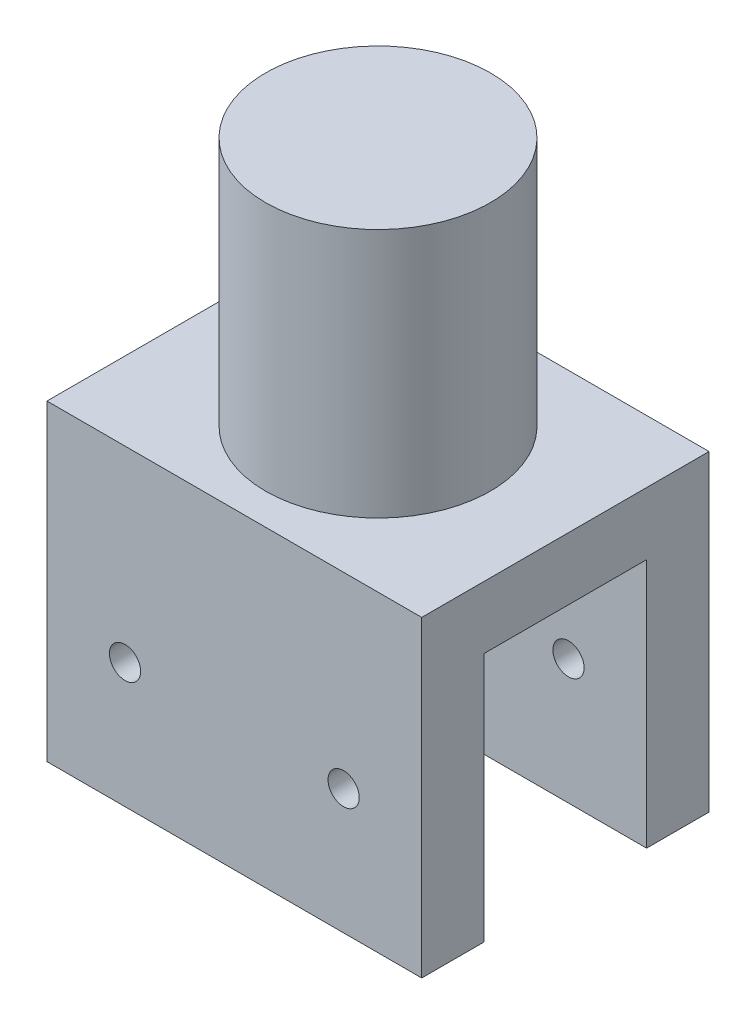
ISO-10303-21;
HEADER;
FILE_DESCRIPTION(('STEP AP214'),'2;1');
FILE_NAME('part.step','',(''),(''),'','','');
FILE_SCHEMA(('AUTOMOTIVE_DESIGN { 1 0 10303 214 1 1 1 1 }'));
ENDSEC;
DATA;
#1=APPLICATION_CONTEXT('core data for automotive mechanical design processes');
#2=APPLICATION_PROTOCOL_DEFINITION('international standard','automotive_design',2000,#1);
#3=PRODUCT_CONTEXT('',#1,'mechanical');
#4=PRODUCT('Part','Part','',(#3));
#5=PRODUCT_RELATED_PRODUCT_CATEGORY('part','',(#4));
#6=PRODUCT_DEFINITION_FORMATION('','',#4);
#7=PRODUCT_DEFINITION_CONTEXT('part definition',#1,'design');
#8=PRODUCT_DEFINITION('design','',#6,#7);
#9=PRODUCT_DEFINITION_SHAPE('','',#8);
#10=(LENGTH_UNIT() NAMED_UNIT(*) SI_UNIT(.MILLI.,.METRE.));
#11=(NAMED_UNIT(*) PLANE_ANGLE_UNIT() SI_UNIT($,.RADIAN.));
#12=(NAMED_UNIT(*) SI_UNIT($,.STERADIAN.) SOLID_ANGLE_UNIT());
#13=UNCERTAINTY_MEASURE_WITH_UNIT(LENGTH_MEASURE(1.E-05),#10,'distance_accuracy_value','');
#14=(GEOMETRIC_REPRESENTATION_CONTEXT(3) GLOBAL_UNCERTAINTY_ASSIGNED_CONTEXT((#13)) GLOBAL_UNIT_ASSIGNED_CONTEXT((#10,
#11,#12)) REPRESENTATION_CONTEXT('',''));
#15=CARTESIAN_POINT('',(0.,0.,0.));
#16=DIRECTION('',(0.,0.,1.));
#17=DIRECTION('',(1.,0.,0.));
#18=AXIS2_PLACEMENT_3D('',#15,#16,#17);
#19=CARTESIAN_POINT('',(0.,0.,0.));
#20=DIRECTION('',(0.,1.,0.));
#21=DIRECTION('',(0.,0.,1.));
#22=AXIS2_PLACEMENT_3D('',#19,#20,#21);
#23=PLANE('',#22);
#24=DIRECTION('',(-1.,0.,0.));
#25=VECTOR('',#24,1.);
#26=CARTESIAN_POINT('',(-30.,0.,-13.));
#27=LINE('',#26,#25);
#28=CARTESIAN_POINT('',(30.,0.,-13.));
#29=VERTEX_POINT('',#28);
#30=CARTESIAN_POINT('',(-30.,0.,-13.));
#31=VERTEX_POINT('',#30);
#32=EDGE_CURVE('E125',#29,#31,#27,.T.);
#33=ORIENTED_EDGE('',*,*,#32,.F.);
#34=DIRECTION('',(0.,0.,-1.));
#35=VECTOR('',#34,1.);
#36=CARTESIAN_POINT('',(30.,0.,-23.));
#37=LINE('',#36,#35);
#38=CARTESIAN_POINT('',(30.,0.,13.));
#39=VERTEX_POINT('',#38);
#40=EDGE_CURVE('E156',#39,#29,#37,.T.);
#41=ORIENTED_EDGE('',*,*,#40,.F.);
#42=DIRECTION('',(1.,0.,0.));
#43=VECTOR('',#42,1.);
#44=CARTESIAN_POINT('',(-30.,0.,13.));
#45=LINE('',#44,#43);
#46=CARTESIAN_POINT('',(-30.,0.,13.));
#47=VERTEX_POINT('',#46);
#48=EDGE_CURVE('E136',#47,#39,#45,.T.);
#49=ORIENTED_EDGE('',*,*,#48,.F.);
#50=DIRECTION('',(0.,0.,1.));
#51=VECTOR('',#50,1.);
#52=CARTESIAN_POINT('',(-30.,0.,-23.));
#53=LINE('',#52,#51);
#54=EDGE_CURVE('E59',#31,#47,#53,.T.);
#55=ORIENTED_EDGE('',*,*,#54,.F.);
#56=EDGE_LOOP('',(#33,#41,#49,#55));
#57=FACE_BOUND('',#56,.T.);
#58=ADVANCED_FACE('F37',(#57),#23,.F.);
#59=CARTESIAN_POINT('',(30.,10.,-23.));
#60=DIRECTION('',(-1.,0.,0.));
#61=DIRECTION('',(0.,0.,1.));
#62=AXIS2_PLACEMENT_3D('',#59,#60,#61);
#63=PLANE('',#62);
#64=DIRECTION('',(0.,-1.,0.));
#65=VECTOR('',#64,1.);
#66=CARTESIAN_POINT('',(30.,10.,23.));
#67=LINE('',#66,#65);
#68=CARTESIAN_POINT('',(30.,10.,23.));
#69=VERTEX_POINT('',#68);
#70=CARTESIAN_POINT('',(30.,-40.,23.));
#71=VERTEX_POINT('',#70);
#72=EDGE_CURVE('E165',#69,#71,#67,.T.);
#73=ORIENTED_EDGE('',*,*,#72,.T.);
#74=DIRECTION('',(0.,0.,1.));
#75=VECTOR('',#74,1.);
#76=CARTESIAN_POINT('',(30.,-40.,23.));
#77=LINE('',#76,#75);
#78=CARTESIAN_POINT('',(30.,-40.,13.));
#79=VERTEX_POINT('',#78);
#80=EDGE_CURVE('E142',#79,#71,#77,.T.);
#81=ORIENTED_EDGE('',*,*,#80,.F.);
#82=DIRECTION('',(0.,1.,0.));
#83=VECTOR('',#82,1.);
#84=CARTESIAN_POINT('',(30.,-40.,13.));
#85=LINE('',#84,#83);
#86=EDGE_CURVE('E148',#79,#39,#85,.T.);
#87=ORIENTED_EDGE('',*,*,#86,.T.);
#88=ORIENTED_EDGE('',*,*,#40,.T.);
#89=DIRECTION('',(0.,1.,0.));
#90=VECTOR('',#89,1.);
#91=CARTESIAN_POINT('',(30.,-40.,-13.));
#92=LINE('',#91,#90);
#93=CARTESIAN_POINT('',(30.,-40.,-13.));
#94=VERTEX_POINT('',#93);
#95=EDGE_CURVE('E134',#94,#29,#92,.T.);
#96=ORIENTED_EDGE('',*,*,#95,.F.);
#97=DIRECTION('',(0.,0.,1.));
#98=VECTOR('',#97,1.);
#99=CARTESIAN_POINT('',(30.,-40.,-23.));
#100=LINE('',#99,#98);
#101=CARTESIAN_POINT('',(30.,-40.,-23.));
#102=VERTEX_POINT('',#101);
#103=EDGE_CURVE('E120',#102,#94,#100,.T.);
#104=ORIENTED_EDGE('',*,*,#103,.F.);
#105=DIRECTION('',(0.,-1.,0.));
#106=VECTOR('',#105,1.);
#107=CARTESIAN_POINT('',(30.,10.,-23.));
#108=LINE('',#107,#106);
#109=CARTESIAN_POINT('',(30.,10.,-23.));
#110=VERTEX_POINT('',#109);
#111=EDGE_CURVE('E46',#110,#102,#108,.T.);
#112=ORIENTED_EDGE('',*,*,#111,.F.);
#113=DIRECTION('',(0.,0.,-1.));
#114=VECTOR('',#113,1.);
#115=CARTESIAN_POINT('',(30.,10.,-23.));
#116=LINE('',#115,#114);
#117=EDGE_CURVE('E157',#69,#110,#116,.T.);
#118=ORIENTED_EDGE('',*,*,#117,.F.);
#119=EDGE_LOOP('',(#73,#81,#87,#88,#96,#104,#112,#118));
#120=FACE_BOUND('',#119,.T.);
#121=ADVANCED_FACE('F39',(#120),#63,.F.);
#122=CARTESIAN_POINT('',(-30.,10.,-23.));
#123=DIRECTION('',(0.,0.,1.));
#124=DIRECTION('',(1.,0.,0.));
#125=AXIS2_PLACEMENT_3D('',#122,#123,#124);
#126=PLANE('',#125);
#127=CARTESIAN_POINT('',(17.5,-20.,-23.));
#128=DIRECTION('',(0.,0.,-1.));
#129=DIRECTION('',(-1.,0.,0.));
#130=AXIS2_PLACEMENT_3D('',#127,#128,#129);
#131=CIRCLE('',#130,2.5);
#132=CARTESIAN_POINT('',(15.,-20.,-23.));
#133=VERTEX_POINT('',#132);
#134=EDGE_CURVE('E180',#133,#133,#131,.T.);
#135=ORIENTED_EDGE('',*,*,#134,.F.);
#136=EDGE_LOOP('',(#135));
#137=FACE_BOUND('',#136,.T.);
#138=CARTESIAN_POINT('',(-17.5,-20.,-23.));
#139=DIRECTION('',(0.,0.,-1.));
#140=DIRECTION('',(-1.,0.,0.));
#141=AXIS2_PLACEMENT_3D('',#138,#139,#140);
#142=CIRCLE('',#141,2.5);
#143=CARTESIAN_POINT('',(-20.,-20.,-23.));
#144=VERTEX_POINT('',#143);
#145=EDGE_CURVE('E190',#144,#144,#142,.T.);
#146=ORIENTED_EDGE('',*,*,#145,.F.);
#147=EDGE_LOOP('',(#146));
#148=FACE_BOUND('',#147,.T.);
#149=ORIENTED_EDGE('',*,*,#111,.T.);
#150=DIRECTION('',(1.,0.,0.));
#151=VECTOR('',#150,1.);
#152=CARTESIAN_POINT('',(-30.,-40.,-23.));
#153=LINE('',#152,#151);
#154=CARTESIAN_POINT('',(-30.,-40.,-23.));
#155=VERTEX_POINT('',#154);
#156=EDGE_CURVE('E115',#155,#102,#153,.T.);
#157=ORIENTED_EDGE('',*,*,#156,.F.);
#158=DIRECTION('',(0.,-1.,0.));
#159=VECTOR('',#158,1.);
#160=CARTESIAN_POINT('',(-30.,10.,-23.));
#161=LINE('',#160,#159);
#162=CARTESIAN_POINT('',(-30.,10.,-23.));
#163=VERTEX_POINT('',#162);
#164=EDGE_CURVE('E104',#163,#155,#161,.T.);
#165=ORIENTED_EDGE('',*,*,#164,.F.);
#166=DIRECTION('',(-1.,0.,0.));
#167=VECTOR('',#166,1.);
#168=CARTESIAN_POINT('',(-30.,10.,-23.));
#169=LINE('',#168,#167);
#170=EDGE_CURVE('E160',#110,#163,#169,.T.);
#171=ORIENTED_EDGE('',*,*,#170,.F.);
#172=EDGE_LOOP('',(#149,#157,#165,#171));
#173=FACE_BOUND('',#172,.T.);
#174=ADVANCED_FACE('F116',(#137,#148,#173),#126,.F.);
#175=CARTESIAN_POINT('',(-30.,10.,-23.));
#176=DIRECTION('',(1.,0.,0.));
#177=DIRECTION('',(0.,0.,-1.));
#178=AXIS2_PLACEMENT_3D('',#175,#176,#177);
#179=PLANE('',#178);
#180=ORIENTED_EDGE('',*,*,#164,.T.);
#181=DIRECTION('',(0.,0.,-1.));
#182=VECTOR('',#181,1.);
#183=CARTESIAN_POINT('',(-30.,-40.,-23.));
#184=LINE('',#183,#182);
#185=CARTESIAN_POINT('',(-30.,-40.,-13.));
#186=VERTEX_POINT('',#185);
#187=EDGE_CURVE('E108',#186,#155,#184,.T.);
#188=ORIENTED_EDGE('',*,*,#187,.F.);
#189=DIRECTION('',(0.,1.,0.));
#190=VECTOR('',#189,1.);
#191=CARTESIAN_POINT('',(-30.,-40.,-13.));
#192=LINE('',#191,#190);
#193=EDGE_CURVE('E54',#186,#31,#192,.T.);
#194=ORIENTED_EDGE('',*,*,#193,.T.);
#195=ORIENTED_EDGE('',*,*,#54,.T.);
#196=DIRECTION('',(0.,1.,0.));
#197=VECTOR('',#196,1.);
#198=CARTESIAN_POINT('',(-30.,-40.,13.));
#199=LINE('',#198,#197);
#200=CARTESIAN_POINT('',(-30.,-40.,13.));
#201=VERTEX_POINT('',#200);
#202=EDGE_CURVE('E153',#201,#47,#199,.T.);
#203=ORIENTED_EDGE('',*,*,#202,.F.);
#204=DIRECTION('',(0.,0.,-1.));
#205=VECTOR('',#204,1.);
#206=CARTESIAN_POINT('',(-30.,-40.,23.));
#207=LINE('',#206,#205);
#208=CARTESIAN_POINT('',(-30.,-40.,23.));
#209=VERTEX_POINT('',#208);
#210=EDGE_CURVE('E137',#209,#201,#207,.T.);
#211=ORIENTED_EDGE('',*,*,#210,.F.);
#212=DIRECTION('',(0.,-1.,0.));
#213=VECTOR('',#212,1.);
#214=CARTESIAN_POINT('',(-30.,10.,23.));
#215=LINE('',#214,#213);
#216=CARTESIAN_POINT('',(-30.,10.,23.));
#217=VERTEX_POINT('',#216);
#218=EDGE_CURVE('E112',#217,#209,#215,.T.);
#219=ORIENTED_EDGE('',*,*,#218,.F.);
#220=DIRECTION('',(0.,0.,1.));
#221=VECTOR('',#220,1.);
#222=CARTESIAN_POINT('',(-30.,10.,-23.));
#223=LINE('',#222,#221);
#224=EDGE_CURVE('E110',#163,#217,#223,.T.);
#225=ORIENTED_EDGE('',*,*,#224,.F.);
#226=EDGE_LOOP('',(#180,#188,#194,#195,#203,#211,#219,#225));
#227=FACE_BOUND('',#226,.T.);
#228=ADVANCED_FACE('F106',(#227),#179,.F.);
#229=CARTESIAN_POINT('',(-30.,10.,23.));
#230=DIRECTION('',(0.,0.,-1.));
#231=DIRECTION('',(-1.,0.,0.));
#232=AXIS2_PLACEMENT_3D('',#229,#230,#231);
#233=PLANE('',#232);
#234=CARTESIAN_POINT('',(17.5,-20.,23.));
#235=DIRECTION('',(0.,0.,-1.));
#236=DIRECTION('',(-1.,0.,0.));
#237=AXIS2_PLACEMENT_3D('',#234,#235,#236);
#238=CIRCLE('',#237,2.5);
#239=CARTESIAN_POINT('',(15.,-20.,23.));
#240=VERTEX_POINT('',#239);
#241=EDGE_CURVE('E174',#240,#240,#238,.T.);
#242=ORIENTED_EDGE('',*,*,#241,.T.);
#243=EDGE_LOOP('',(#242));
#244=FACE_BOUND('',#243,.T.);
#245=CARTESIAN_POINT('',(-17.5,-20.,23.));
#246=DIRECTION('',(0.,0.,-1.));
#247=DIRECTION('',(-1.,0.,0.));
#248=AXIS2_PLACEMENT_3D('',#245,#246,#247);
#249=CIRCLE('',#248,2.5);
#250=CARTESIAN_POINT('',(-20.,-20.,23.));
#251=VERTEX_POINT('',#250);
#252=EDGE_CURVE('E185',#251,#251,#249,.T.);
#253=ORIENTED_EDGE('',*,*,#252,.T.);
#254=EDGE_LOOP('',(#253));
#255=FACE_BOUND('',#254,.T.);
#256=ORIENTED_EDGE('',*,*,#218,.T.);
#257=DIRECTION('',(-1.,0.,0.));
#258=VECTOR('',#257,1.);
#259=CARTESIAN_POINT('',(-30.,-40.,23.));
#260=LINE('',#259,#258);
#261=EDGE_CURVE('E145',#71,#209,#260,.T.);
#262=ORIENTED_EDGE('',*,*,#261,.F.);
#263=ORIENTED_EDGE('',*,*,#72,.F.);
#264=DIRECTION('',(1.,0.,0.));
#265=VECTOR('',#264,1.);
#266=CARTESIAN_POINT('',(-30.,10.,23.));
#267=LINE('',#266,#265);
#268=EDGE_CURVE('E163',#217,#69,#267,.T.);
#269=ORIENTED_EDGE('',*,*,#268,.F.);
#270=EDGE_LOOP('',(#256,#262,#263,#269));
#271=FACE_BOUND('',#270,.T.);
#272=ADVANCED_FACE('F210',(#244,#255,#271),#233,.F.);
#273=CARTESIAN_POINT('',(0.,10.,0.));
#274=DIRECTION('',(0.,1.,0.));
#275=DIRECTION('',(0.,0.,1.));
#276=AXIS2_PLACEMENT_3D('',#273,#274,#275);
#277=PLANE('',#276);
#278=CARTESIAN_POINT('',(0.,10.,0.));
#279=DIRECTION('',(0.,1.,0.));
#280=DIRECTION('',(0.,0.,1.));
#281=AXIS2_PLACEMENT_3D('',#278,#279,#280);
#282=CIRCLE('',#281,18.);
#283=CARTESIAN_POINT('',(0.,10.,18.));
#284=VERTEX_POINT('',#283);
#285=EDGE_CURVE('E11',#284,#284,#282,.T.);
#286=ORIENTED_EDGE('',*,*,#285,.F.);
#287=EDGE_LOOP('',(#286));
#288=FACE_BOUND('',#287,.T.);
#289=ORIENTED_EDGE('',*,*,#117,.T.);
#290=ORIENTED_EDGE('',*,*,#170,.T.);
#291=ORIENTED_EDGE('',*,*,#224,.T.);
#292=ORIENTED_EDGE('',*,*,#268,.T.);
#293=EDGE_LOOP('',(#289,#290,#291,#292));
#294=FACE_BOUND('',#293,.T.);
#295=ADVANCED_FACE('F206',(#288,#294),#277,.T.);
#296=CARTESIAN_POINT('',(-30.,-40.,13.));
#297=DIRECTION('',(0.,0.,1.));
#298=DIRECTION('',(1.,0.,0.));
#299=AXIS2_PLACEMENT_3D('',#296,#297,#298);
#300=PLANE('',#299);
#301=CARTESIAN_POINT('',(17.5,-20.,13.));
#302=DIRECTION('',(0.,0.,1.));
#303=DIRECTION('',(1.,0.,0.));
#304=AXIS2_PLACEMENT_3D('',#301,#302,#303);
#305=CIRCLE('',#304,2.5);
#306=CARTESIAN_POINT('',(20.,-20.,13.));
#307=VERTEX_POINT('',#306);
#308=EDGE_CURVE('E193',#307,#307,#305,.T.);
#309=ORIENTED_EDGE('',*,*,#308,.T.);
#310=EDGE_LOOP('',(#309));
#311=FACE_BOUND('',#310,.T.);
#312=CARTESIAN_POINT('',(-17.5,-20.,13.));
#313=DIRECTION('',(0.,0.,1.));
#314=DIRECTION('',(1.,0.,0.));
#315=AXIS2_PLACEMENT_3D('',#312,#313,#314);
#316=CIRCLE('',#315,2.5);
#317=CARTESIAN_POINT('',(-15.,-20.,13.));
#318=VERTEX_POINT('',#317);
#319=EDGE_CURVE('E173',#318,#318,#316,.T.);
#320=ORIENTED_EDGE('',*,*,#319,.T.);
#321=EDGE_LOOP('',(#320));
#322=FACE_BOUND('',#321,.T.);
#323=ORIENTED_EDGE('',*,*,#48,.T.);
#324=ORIENTED_EDGE('',*,*,#86,.F.);
#325=DIRECTION('',(1.,0.,0.));
#326=VECTOR('',#325,1.);
#327=CARTESIAN_POINT('',(-30.,-40.,13.));
#328=LINE('',#327,#326);
#329=EDGE_CURVE('E140',#201,#79,#328,.T.);
#330=ORIENTED_EDGE('',*,*,#329,.F.);
#331=ORIENTED_EDGE('',*,*,#202,.T.);
#332=EDGE_LOOP('',(#323,#324,#330,#331));
#333=FACE_BOUND('',#332,.T.);
#334=ADVANCED_FACE('F209',(#311,#322,#333),#300,.F.);
#335=CARTESIAN_POINT('',(0.,-40.,0.));
#336=DIRECTION('',(0.,-1.,0.));
#337=DIRECTION('',(0.,0.,-1.));
#338=AXIS2_PLACEMENT_3D('',#335,#336,#337);
#339=PLANE('',#338);
#340=ORIENTED_EDGE('',*,*,#210,.T.);
#341=ORIENTED_EDGE('',*,*,#329,.T.);
#342=ORIENTED_EDGE('',*,*,#80,.T.);
#343=ORIENTED_EDGE('',*,*,#261,.T.);
#344=EDGE_LOOP('',(#340,#341,#342,#343));
#345=FACE_BOUND('',#344,.T.);
#346=ADVANCED_FACE('F225',(#345),#339,.T.);
#347=CARTESIAN_POINT('',(-30.,-40.,-13.));
#348=DIRECTION('',(0.,0.,-1.));
#349=DIRECTION('',(-1.,0.,0.));
#350=AXIS2_PLACEMENT_3D('',#347,#348,#349);
#351=PLANE('',#350);
#352=CARTESIAN_POINT('',(17.5,-20.,-13.));
#353=DIRECTION('',(0.,0.,-1.));
#354=DIRECTION('',(-1.,0.,0.));
#355=AXIS2_PLACEMENT_3D('',#352,#353,#354);
#356=CIRCLE('',#355,2.5);
#357=CARTESIAN_POINT('',(15.,-20.,-13.));
#358=VERTEX_POINT('',#357);
#359=EDGE_CURVE('E41',#358,#358,#356,.T.);
#360=ORIENTED_EDGE('',*,*,#359,.T.);
#361=EDGE_LOOP('',(#360));
#362=FACE_BOUND('',#361,.T.);
#363=CARTESIAN_POINT('',(-17.5,-20.,-13.));
#364=DIRECTION('',(0.,0.,-1.));
#365=DIRECTION('',(-1.,0.,0.));
#366=AXIS2_PLACEMENT_3D('',#363,#364,#365);
#367=CIRCLE('',#366,2.5);
#368=CARTESIAN_POINT('',(-20.,-20.,-13.));
#369=VERTEX_POINT('',#368);
#370=EDGE_CURVE('E171',#369,#369,#367,.T.);
#371=ORIENTED_EDGE('',*,*,#370,.T.);
#372=EDGE_LOOP('',(#371));
#373=FACE_BOUND('',#372,.T.);
#374=ORIENTED_EDGE('',*,*,#32,.T.);
#375=ORIENTED_EDGE('',*,*,#193,.F.);
#376=DIRECTION('',(-1.,0.,0.));
#377=VECTOR('',#376,1.);
#378=CARTESIAN_POINT('',(-30.,-40.,-13.));
#379=LINE('',#378,#377);
#380=EDGE_CURVE('E124',#94,#186,#379,.T.);
#381=ORIENTED_EDGE('',*,*,#380,.F.);
#382=ORIENTED_EDGE('',*,*,#95,.T.);
#383=EDGE_LOOP('',(#374,#375,#381,#382));
#384=FACE_BOUND('',#383,.T.);
#385=ADVANCED_FACE('F219',(#362,#373,#384),#351,.F.);
#386=CARTESIAN_POINT('',(0.,-40.,0.));
#387=DIRECTION('',(0.,1.,0.));
#388=DIRECTION('',(0.,0.,1.));
#389=AXIS2_PLACEMENT_3D('',#386,#387,#388);
#390=PLANE('',#389);
#391=ORIENTED_EDGE('',*,*,#187,.T.);
#392=ORIENTED_EDGE('',*,*,#156,.T.);
#393=ORIENTED_EDGE('',*,*,#103,.T.);
#394=ORIENTED_EDGE('',*,*,#380,.T.);
#395=EDGE_LOOP('',(#391,#392,#393,#394));
#396=FACE_BOUND('',#395,.T.);
#397=ADVANCED_FACE('F122',(#396),#390,.F.);
#398=CARTESIAN_POINT('',(0.,50.,0.));
#399=DIRECTION('',(0.,-1.,0.));
#400=DIRECTION('',(0.,0.,-1.));
#401=AXIS2_PLACEMENT_3D('',#398,#399,#400);
#402=CYLINDRICAL_SURFACE('',#401,18.);
#403=CARTESIAN_POINT('',(0.,50.,0.));
#404=DIRECTION('',(0.,1.,0.));
#405=DIRECTION('',(0.,0.,1.));
#406=AXIS2_PLACEMENT_3D('',#403,#404,#405);
#407=CIRCLE('',#406,18.);
#408=CARTESIAN_POINT('',(0.,50.,18.));
#409=VERTEX_POINT('',#408);
#410=EDGE_CURVE('E127',#409,#409,#407,.T.);
#411=ORIENTED_EDGE('',*,*,#410,.F.);
#412=EDGE_LOOP('',(#411));
#413=FACE_BOUND('',#412,.T.);
#414=ORIENTED_EDGE('',*,*,#285,.T.);
#415=EDGE_LOOP('',(#414));
#416=FACE_BOUND('',#415,.T.);
#417=ADVANCED_FACE('F200',(#413,#416),#402,.T.);
#418=CARTESIAN_POINT('',(0.,50.,0.));
#419=DIRECTION('',(0.,1.,0.));
#420=DIRECTION('',(0.,0.,1.));
#421=AXIS2_PLACEMENT_3D('',#418,#419,#420);
#422=PLANE('',#421);
#423=ORIENTED_EDGE('',*,*,#410,.T.);
#424=EDGE_LOOP('',(#423));
#425=FACE_BOUND('',#424,.T.);
#426=ADVANCED_FACE('F198',(#425),#422,.T.);
#427=CARTESIAN_POINT('',(-17.5,-20.,23.));
#428=DIRECTION('',(0.,0.,-1.));
#429=DIRECTION('',(-1.,0.,0.));
#430=AXIS2_PLACEMENT_3D('',#427,#428,#429);
#431=CYLINDRICAL_SURFACE('',#430,2.5);
#432=ORIENTED_EDGE('',*,*,#145,.T.);
#433=EDGE_LOOP('',(#432));
#434=FACE_BOUND('',#433,.T.);
#435=ORIENTED_EDGE('',*,*,#370,.F.);
#436=EDGE_LOOP('',(#435));
#437=FACE_BOUND('',#436,.T.);
#438=ADVANCED_FACE('F254',(#434,#437),#431,.F.);
#439=CARTESIAN_POINT('',(17.5,-20.,23.));
#440=DIRECTION('',(0.,0.,-1.));
#441=DIRECTION('',(-1.,0.,0.));
#442=AXIS2_PLACEMENT_3D('',#439,#440,#441);
#443=CYLINDRICAL_SURFACE('',#442,2.5);
#444=ORIENTED_EDGE('',*,*,#134,.T.);
#445=EDGE_LOOP('',(#444));
#446=FACE_BOUND('',#445,.T.);
#447=ORIENTED_EDGE('',*,*,#359,.F.);
#448=EDGE_LOOP('',(#447));
#449=FACE_BOUND('',#448,.T.);
#450=ADVANCED_FACE('F259',(#446,#449),#443,.F.);
#451=ORIENTED_EDGE('',*,*,#252,.F.);
#452=EDGE_LOOP('',(#451));
#453=FACE_BOUND('',#452,.T.);
#454=ORIENTED_EDGE('',*,*,#319,.F.);
#455=EDGE_LOOP('',(#454));
#456=FACE_BOUND('',#455,.T.);
#457=ADVANCED_FACE('F255',(#453,#456),#431,.F.);
#458=ORIENTED_EDGE('',*,*,#241,.F.);
#459=EDGE_LOOP('',(#458));
#460=FACE_BOUND('',#459,.T.);
#461=ORIENTED_EDGE('',*,*,#308,.F.);
#462=EDGE_LOOP('',(#461));
#463=FACE_BOUND('',#462,.T.);
#464=ADVANCED_FACE('F258',(#460,#463),#443,.F.);
#465=CLOSED_SHELL('',(#58,#121,#174,#228,#272,#295,#334,#346,#385,#397,#417,#426,#438,#450,#457,#464));
#466=MANIFOLD_SOLID_BREP('B2',#465);
#467=ADVANCED_BREP_SHAPE_REPRESENTATION('',(#18,#466),#14);
#468=SHAPE_DEFINITION_REPRESENTATION(#9,#467);
ENDSEC;
END-ISO-10303-21;
